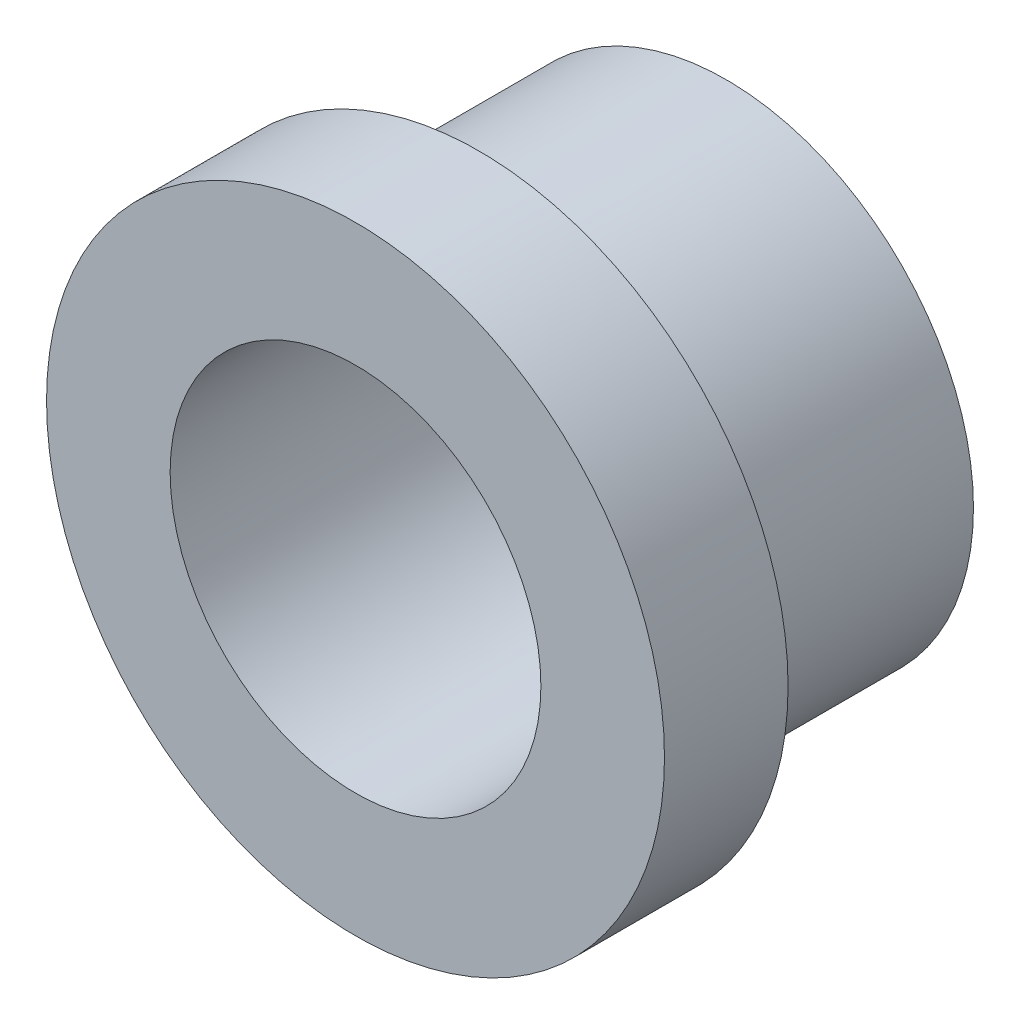
ISO-10303-21;
HEADER;
FILE_DESCRIPTION(('STEP AP214'),'2;1');
FILE_NAME('part.step','',(''),(''),'','','');
FILE_SCHEMA(('AUTOMOTIVE_DESIGN { 1 0 10303 214 1 1 1 1 }'));
ENDSEC;
DATA;
#1=APPLICATION_CONTEXT('core data for automotive mechanical design processes');
#2=APPLICATION_PROTOCOL_DEFINITION('international standard','automotive_design',2000,#1);
#3=PRODUCT_CONTEXT('',#1,'mechanical');
#4=PRODUCT('Part','Part','',(#3));
#5=PRODUCT_RELATED_PRODUCT_CATEGORY('part','',(#4));
#6=PRODUCT_DEFINITION_FORMATION('','',#4);
#7=PRODUCT_DEFINITION_CONTEXT('part definition',#1,'design');
#8=PRODUCT_DEFINITION('design','',#6,#7);
#9=PRODUCT_DEFINITION_SHAPE('','',#8);
#10=(LENGTH_UNIT() NAMED_UNIT(*) SI_UNIT(.MILLI.,.METRE.));
#11=(NAMED_UNIT(*) PLANE_ANGLE_UNIT() SI_UNIT($,.RADIAN.));
#12=(NAMED_UNIT(*) SI_UNIT($,.STERADIAN.) SOLID_ANGLE_UNIT());
#13=UNCERTAINTY_MEASURE_WITH_UNIT(LENGTH_MEASURE(1.E-05),#10,'distance_accuracy_value','');
#14=(GEOMETRIC_REPRESENTATION_CONTEXT(3) GLOBAL_UNCERTAINTY_ASSIGNED_CONTEXT((#13)) GLOBAL_UNIT_ASSIGNED_CONTEXT((#10,
#11,#12)) REPRESENTATION_CONTEXT('',''));
#15=CARTESIAN_POINT('',(0.,0.,0.));
#16=DIRECTION('',(0.,0.,1.));
#17=DIRECTION('',(1.,0.,0.));
#18=AXIS2_PLACEMENT_3D('',#15,#16,#17);
#19=CARTESIAN_POINT('',(0.,0.,0.));
#20=DIRECTION('',(0.,0.,1.));
#21=DIRECTION('',(1.,0.,0.));
#22=AXIS2_PLACEMENT_3D('',#19,#20,#21);
#23=PLANE('',#22);
#24=CARTESIAN_POINT('',(0.,0.,0.));
#25=DIRECTION('',(0.,0.,1.));
#26=DIRECTION('',(1.,0.,0.));
#27=AXIS2_PLACEMENT_3D('',#24,#25,#26);
#28=CIRCLE('',#27,6.35);
#29=CARTESIAN_POINT('',(6.35,0.,0.));
#30=VERTEX_POINT('',#29);
#31=EDGE_CURVE('E35',#30,#30,#28,.T.);
#32=ORIENTED_EDGE('',*,*,#31,.F.);
#33=EDGE_LOOP('',(#32));
#34=FACE_BOUND('',#33,.T.);
#35=CARTESIAN_POINT('',(0.,0.,0.));
#36=DIRECTION('',(0.,0.,1.));
#37=DIRECTION('',(1.,0.,0.));
#38=AXIS2_PLACEMENT_3D('',#35,#36,#37);
#39=CIRCLE('',#38,4.7625);
#40=CARTESIAN_POINT('',(4.7625,0.,0.));
#41=VERTEX_POINT('',#40);
#42=EDGE_CURVE('E42',#41,#41,#39,.T.);
#43=ORIENTED_EDGE('',*,*,#42,.T.);
#44=EDGE_LOOP('',(#43));
#45=FACE_BOUND('',#44,.T.);
#46=ADVANCED_FACE('F31',(#34,#45),#23,.F.);
#47=CARTESIAN_POINT('',(0.,0.,6.35));
#48=DIRECTION('',(0.,0.,-1.));
#49=DIRECTION('',(-1.,0.,0.));
#50=AXIS2_PLACEMENT_3D('',#47,#48,#49);
#51=CYLINDRICAL_SURFACE('',#50,6.35);
#52=CARTESIAN_POINT('',(0.,0.,6.35));
#53=DIRECTION('',(0.,0.,1.));
#54=DIRECTION('',(1.,0.,0.));
#55=AXIS2_PLACEMENT_3D('',#52,#53,#54);
#56=CIRCLE('',#55,6.35);
#57=CARTESIAN_POINT('',(6.35,0.,6.35));
#58=VERTEX_POINT('',#57);
#59=EDGE_CURVE('E10',#58,#58,#56,.T.);
#60=ORIENTED_EDGE('',*,*,#59,.F.);
#61=EDGE_LOOP('',(#60));
#62=FACE_BOUND('',#61,.T.);
#63=ORIENTED_EDGE('',*,*,#31,.T.);
#64=EDGE_LOOP('',(#63));
#65=FACE_BOUND('',#64,.T.);
#66=ADVANCED_FACE('F33',(#62,#65),#51,.T.);
#67=CARTESIAN_POINT('',(0.,0.,6.35));
#68=DIRECTION('',(0.,0.,-1.));
#69=DIRECTION('',(-1.,0.,0.));
#70=AXIS2_PLACEMENT_3D('',#67,#68,#69);
#71=CYLINDRICAL_SURFACE('',#70,4.7625);
#72=ORIENTED_EDGE('',*,*,#42,.F.);
#73=EDGE_LOOP('',(#72));
#74=FACE_BOUND('',#73,.T.);
#75=CARTESIAN_POINT('',(0.,0.,9.525));
#76=DIRECTION('',(0.,0.,1.));
#77=DIRECTION('',(1.,0.,0.));
#78=AXIS2_PLACEMENT_3D('',#75,#76,#77);
#79=CIRCLE('',#78,4.7625);
#80=CARTESIAN_POINT('',(4.7625,0.,9.525));
#81=VERTEX_POINT('',#80);
#82=EDGE_CURVE('E50',#81,#81,#79,.T.);
#83=ORIENTED_EDGE('',*,*,#82,.T.);
#84=EDGE_LOOP('',(#83));
#85=FACE_BOUND('',#84,.T.);
#86=ADVANCED_FACE('F56',(#74,#85),#71,.F.);
#87=CARTESIAN_POINT('',(0.,0.,6.35));
#88=DIRECTION('',(0.,0.,1.));
#89=DIRECTION('',(1.,0.,0.));
#90=AXIS2_PLACEMENT_3D('',#87,#88,#89);
#91=PLANE('',#90);
#92=CARTESIAN_POINT('',(0.,0.,6.35));
#93=DIRECTION('',(0.,0.,1.));
#94=DIRECTION('',(1.,0.,0.));
#95=AXIS2_PLACEMENT_3D('',#92,#93,#94);
#96=CIRCLE('',#95,7.9375);
#97=CARTESIAN_POINT('',(7.9375,0.,6.35));
#98=VERTEX_POINT('',#97);
#99=EDGE_CURVE('E47',#98,#98,#96,.T.);
#100=ORIENTED_EDGE('',*,*,#99,.F.);
#101=EDGE_LOOP('',(#100));
#102=FACE_BOUND('',#101,.T.);
#103=ORIENTED_EDGE('',*,*,#59,.T.);
#104=EDGE_LOOP('',(#103));
#105=FACE_BOUND('',#104,.T.);
#106=ADVANCED_FACE('F61',(#102,#105),#91,.F.);
#107=CARTESIAN_POINT('',(0.,0.,9.525));
#108=DIRECTION('',(0.,0.,1.));
#109=DIRECTION('',(1.,0.,0.));
#110=AXIS2_PLACEMENT_3D('',#107,#108,#109);
#111=PLANE('',#110);
#112=CARTESIAN_POINT('',(0.,0.,9.525));
#113=DIRECTION('',(0.,0.,1.));
#114=DIRECTION('',(1.,0.,0.));
#115=AXIS2_PLACEMENT_3D('',#112,#113,#114);
#116=CIRCLE('',#115,7.9375);
#117=CARTESIAN_POINT('',(7.9375,0.,9.525));
#118=VERTEX_POINT('',#117);
#119=EDGE_CURVE('E46',#118,#118,#116,.T.);
#120=ORIENTED_EDGE('',*,*,#119,.T.);
#121=EDGE_LOOP('',(#120));
#122=FACE_BOUND('',#121,.T.);
#123=ORIENTED_EDGE('',*,*,#82,.F.);
#124=EDGE_LOOP('',(#123));
#125=FACE_BOUND('',#124,.T.);
#126=ADVANCED_FACE('F58',(#122,#125),#111,.T.);
#127=CARTESIAN_POINT('',(0.,0.,9.525));
#128=DIRECTION('',(0.,0.,-1.));
#129=DIRECTION('',(-1.,0.,0.));
#130=AXIS2_PLACEMENT_3D('',#127,#128,#129);
#131=CYLINDRICAL_SURFACE('',#130,7.9375);
#132=ORIENTED_EDGE('',*,*,#119,.F.);
#133=EDGE_LOOP('',(#132));
#134=FACE_BOUND('',#133,.T.);
#135=ORIENTED_EDGE('',*,*,#99,.T.);
#136=EDGE_LOOP('',(#135));
#137=FACE_BOUND('',#136,.T.);
#138=ADVANCED_FACE('F60',(#134,#137),#131,.T.);
#139=CLOSED_SHELL('',(#46,#66,#86,#106,#126,#138));
#140=MANIFOLD_SOLID_BREP('B2',#139);
#141=ADVANCED_BREP_SHAPE_REPRESENTATION('',(#18,#140),#14);
#142=SHAPE_DEFINITION_REPRESENTATION(#9,#141);
ENDSEC;
END-ISO-10303-21;
